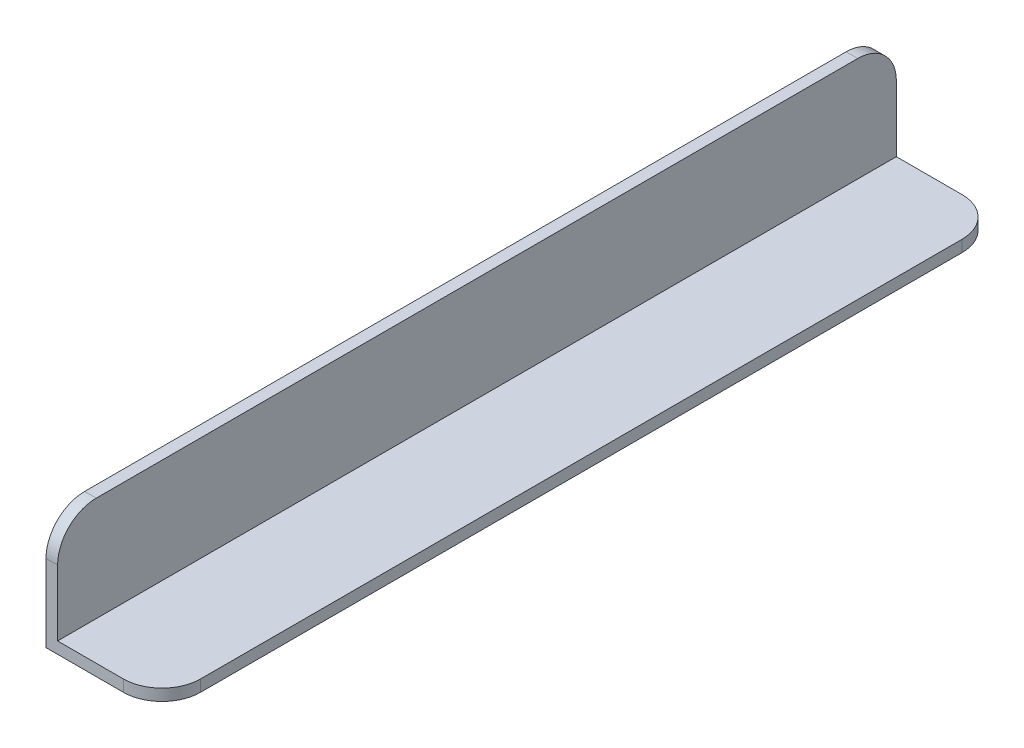
ISO-10303-21;
HEADER;
FILE_DESCRIPTION(('STEP AP214'),'2;1');
FILE_NAME('part.step','',(''),(''),'','','');
FILE_SCHEMA(('AUTOMOTIVE_DESIGN { 1 0 10303 214 1 1 1 1 }'));
ENDSEC;
DATA;
#1=APPLICATION_CONTEXT('core data for automotive mechanical design processes');
#2=APPLICATION_PROTOCOL_DEFINITION('international standard','automotive_design',2000,#1);
#3=PRODUCT_CONTEXT('',#1,'mechanical');
#4=PRODUCT('Part','Part','',(#3));
#5=PRODUCT_RELATED_PRODUCT_CATEGORY('part','',(#4));
#6=PRODUCT_DEFINITION_FORMATION('','',#4);
#7=PRODUCT_DEFINITION_CONTEXT('part definition',#1,'design');
#8=PRODUCT_DEFINITION('design','',#6,#7);
#9=PRODUCT_DEFINITION_SHAPE('','',#8);
#10=(LENGTH_UNIT() NAMED_UNIT(*) SI_UNIT(.MILLI.,.METRE.));
#11=(NAMED_UNIT(*) PLANE_ANGLE_UNIT() SI_UNIT($,.RADIAN.));
#12=(NAMED_UNIT(*) SI_UNIT($,.STERADIAN.) SOLID_ANGLE_UNIT());
#13=UNCERTAINTY_MEASURE_WITH_UNIT(LENGTH_MEASURE(1.E-05),#10,'distance_accuracy_value','');
#14=(GEOMETRIC_REPRESENTATION_CONTEXT(3) GLOBAL_UNCERTAINTY_ASSIGNED_CONTEXT((#13)) GLOBAL_UNIT_ASSIGNED_CONTEXT((#10,
#11,#12)) REPRESENTATION_CONTEXT('',''));
#15=CARTESIAN_POINT('',(0.,0.,0.));
#16=DIRECTION('',(0.,0.,1.));
#17=DIRECTION('',(1.,0.,0.));
#18=AXIS2_PLACEMENT_3D('',#15,#16,#17);
#19=CARTESIAN_POINT('',(0.,60.,217.));
#20=DIRECTION('',(1.,0.,0.));
#21=DIRECTION('',(0.,0.,-1.));
#22=AXIS2_PLACEMENT_3D('',#19,#20,#21);
#23=PLANE('',#22);
#24=DIRECTION('',(0.,0.,-1.));
#25=VECTOR('',#24,1.);
#26=CARTESIAN_POINT('',(0.,60.,217.));
#27=LINE('',#26,#25);
#28=CARTESIAN_POINT('',(0.,60.,197.));
#29=VERTEX_POINT('',#28);
#30=CARTESIAN_POINT('',(0.,60.,-197.));
#31=VERTEX_POINT('',#30);
#32=EDGE_CURVE('E184',#29,#31,#27,.T.);
#33=ORIENTED_EDGE('',*,*,#32,.T.);
#34=CARTESIAN_POINT('',(0.,40.,-197.));
#35=DIRECTION('',(1.,0.,0.));
#36=DIRECTION('',(0.,0.,-1.));
#37=AXIS2_PLACEMENT_3D('',#34,#35,#36);
#38=CIRCLE('',#37,20.);
#39=CARTESIAN_POINT('',(0.,40.,-217.));
#40=VERTEX_POINT('',#39);
#41=EDGE_CURVE('E153',#31,#40,#38,.F.);
#42=ORIENTED_EDGE('',*,*,#41,.T.);
#43=DIRECTION('',(0.,-1.,0.));
#44=VECTOR('',#43,1.);
#45=CARTESIAN_POINT('',(0.,60.,-217.));
#46=LINE('',#45,#44);
#47=CARTESIAN_POINT('',(0.,0.,-217.));
#48=VERTEX_POINT('',#47);
#49=EDGE_CURVE('E137',#40,#48,#46,.T.);
#50=ORIENTED_EDGE('',*,*,#49,.T.);
#51=DIRECTION('',(0.,0.,-1.));
#52=VECTOR('',#51,1.);
#53=CARTESIAN_POINT('',(0.,0.,217.));
#54=LINE('',#53,#52);
#55=CARTESIAN_POINT('',(0.,0.,217.));
#56=VERTEX_POINT('',#55);
#57=EDGE_CURVE('E132',#56,#48,#54,.T.);
#58=ORIENTED_EDGE('',*,*,#57,.F.);
#59=DIRECTION('',(0.,-1.,0.));
#60=VECTOR('',#59,1.);
#61=CARTESIAN_POINT('',(0.,60.,217.));
#62=LINE('',#61,#60);
#63=CARTESIAN_POINT('',(0.,40.,217.));
#64=VERTEX_POINT('',#63);
#65=EDGE_CURVE('E120',#64,#56,#62,.T.);
#66=ORIENTED_EDGE('',*,*,#65,.F.);
#67=CARTESIAN_POINT('',(0.,40.,197.));
#68=DIRECTION('',(1.,0.,0.));
#69=DIRECTION('',(0.,0.,-1.));
#70=AXIS2_PLACEMENT_3D('',#67,#68,#69);
#71=CIRCLE('',#70,20.);
#72=EDGE_CURVE('E151',#64,#29,#71,.F.);
#73=ORIENTED_EDGE('',*,*,#72,.T.);
#74=EDGE_LOOP('',(#33,#42,#50,#58,#66,#73));
#75=FACE_BOUND('',#74,.T.);
#76=ADVANCED_FACE('F41',(#75),#23,.F.);
#77=CARTESIAN_POINT('',(0.,0.,217.));
#78=DIRECTION('',(0.,1.,0.));
#79=DIRECTION('',(0.,0.,1.));
#80=AXIS2_PLACEMENT_3D('',#77,#78,#79);
#81=PLANE('',#80);
#82=DIRECTION('',(1.,0.,0.));
#83=VECTOR('',#82,1.);
#84=CARTESIAN_POINT('',(0.,0.,-217.));
#85=LINE('',#84,#83);
#86=CARTESIAN_POINT('',(40.,0.,-217.));
#87=VERTEX_POINT('',#86);
#88=EDGE_CURVE('E188',#48,#87,#85,.T.);
#89=ORIENTED_EDGE('',*,*,#88,.T.);
#90=CARTESIAN_POINT('',(40.,0.,-197.));
#91=DIRECTION('',(0.,1.,0.));
#92=DIRECTION('',(0.,0.,1.));
#93=AXIS2_PLACEMENT_3D('',#90,#91,#92);
#94=CIRCLE('',#93,20.);
#95=CARTESIAN_POINT('',(60.,0.,-197.));
#96=VERTEX_POINT('',#95);
#97=EDGE_CURVE('E172',#87,#96,#94,.F.);
#98=ORIENTED_EDGE('',*,*,#97,.T.);
#99=DIRECTION('',(0.,0.,-1.));
#100=VECTOR('',#99,1.);
#101=CARTESIAN_POINT('',(60.,0.,217.));
#102=LINE('',#101,#100);
#103=CARTESIAN_POINT('',(60.,0.,197.));
#104=VERTEX_POINT('',#103);
#105=EDGE_CURVE('E140',#104,#96,#102,.T.);
#106=ORIENTED_EDGE('',*,*,#105,.F.);
#107=CARTESIAN_POINT('',(40.,0.,197.));
#108=DIRECTION('',(0.,1.,0.));
#109=DIRECTION('',(0.,0.,1.));
#110=AXIS2_PLACEMENT_3D('',#107,#108,#109);
#111=CIRCLE('',#110,20.);
#112=CARTESIAN_POINT('',(40.,0.,217.));
#113=VERTEX_POINT('',#112);
#114=EDGE_CURVE('E56',#104,#113,#111,.F.);
#115=ORIENTED_EDGE('',*,*,#114,.T.);
#116=DIRECTION('',(1.,0.,0.));
#117=VECTOR('',#116,1.);
#118=CARTESIAN_POINT('',(0.,0.,217.));
#119=LINE('',#118,#117);
#120=EDGE_CURVE('E123',#56,#113,#119,.T.);
#121=ORIENTED_EDGE('',*,*,#120,.F.);
#122=ORIENTED_EDGE('',*,*,#57,.T.);
#123=EDGE_LOOP('',(#89,#98,#106,#115,#121,#122));
#124=FACE_BOUND('',#123,.T.);
#125=ADVANCED_FACE('F131',(#124),#81,.F.);
#126=CARTESIAN_POINT('',(60.,0.,217.));
#127=DIRECTION('',(-1.,0.,0.));
#128=DIRECTION('',(0.,0.,1.));
#129=AXIS2_PLACEMENT_3D('',#126,#127,#128);
#130=PLANE('',#129);
#131=ORIENTED_EDGE('',*,*,#105,.T.);
#132=DIRECTION('',(0.,1.,0.));
#133=VECTOR('',#132,1.);
#134=CARTESIAN_POINT('',(60.,0.,-197.));
#135=LINE('',#134,#133);
#136=CARTESIAN_POINT('',(60.,6.,-197.));
#137=VERTEX_POINT('',#136);
#138=EDGE_CURVE('E165',#96,#137,#135,.T.);
#139=ORIENTED_EDGE('',*,*,#138,.T.);
#140=DIRECTION('',(0.,0.,-1.));
#141=VECTOR('',#140,1.);
#142=CARTESIAN_POINT('',(60.,6.,217.));
#143=LINE('',#142,#141);
#144=CARTESIAN_POINT('',(60.,6.,197.));
#145=VERTEX_POINT('',#144);
#146=EDGE_CURVE('E145',#145,#137,#143,.T.);
#147=ORIENTED_EDGE('',*,*,#146,.F.);
#148=DIRECTION('',(0.,1.,0.));
#149=VECTOR('',#148,1.);
#150=CARTESIAN_POINT('',(60.,0.,197.));
#151=LINE('',#150,#149);
#152=EDGE_CURVE('E163',#145,#104,#151,.F.);
#153=ORIENTED_EDGE('',*,*,#152,.T.);
#154=EDGE_LOOP('',(#131,#139,#147,#153));
#155=FACE_BOUND('',#154,.T.);
#156=ADVANCED_FACE('F200',(#155),#130,.F.);
#157=CARTESIAN_POINT('',(60.,6.,217.));
#158=DIRECTION('',(0.,-1.,0.));
#159=DIRECTION('',(1.,0.,0.));
#160=AXIS2_PLACEMENT_3D('',#157,#158,#159);
#161=PLANE('',#160);
#162=ORIENTED_EDGE('',*,*,#146,.T.);
#163=CARTESIAN_POINT('',(40.,6.,-197.));
#164=DIRECTION('',(0.,-1.,0.));
#165=DIRECTION('',(1.,0.,0.));
#166=AXIS2_PLACEMENT_3D('',#163,#164,#165);
#167=CIRCLE('',#166,20.);
#168=CARTESIAN_POINT('',(40.,6.,-217.));
#169=VERTEX_POINT('',#168);
#170=EDGE_CURVE('E169',#137,#169,#167,.F.);
#171=ORIENTED_EDGE('',*,*,#170,.T.);
#172=DIRECTION('',(-1.,0.,0.));
#173=VECTOR('',#172,1.);
#174=CARTESIAN_POINT('',(60.,6.,-217.));
#175=LINE('',#174,#173);
#176=CARTESIAN_POINT('',(6.,5.99999999999999,-217.));
#177=VERTEX_POINT('',#176);
#178=EDGE_CURVE('E190',#169,#177,#175,.T.);
#179=ORIENTED_EDGE('',*,*,#178,.T.);
#180=DIRECTION('',(0.,0.,-1.));
#181=VECTOR('',#180,1.);
#182=CARTESIAN_POINT('',(6.,5.99999999999999,217.));
#183=LINE('',#182,#181);
#184=CARTESIAN_POINT('',(6.,5.99999999999999,217.));
#185=VERTEX_POINT('',#184);
#186=EDGE_CURVE('E180',#185,#177,#183,.T.);
#187=ORIENTED_EDGE('',*,*,#186,.F.);
#188=DIRECTION('',(-1.,0.,0.));
#189=VECTOR('',#188,1.);
#190=CARTESIAN_POINT('',(60.,6.,217.));
#191=LINE('',#190,#189);
#192=CARTESIAN_POINT('',(40.,6.,217.));
#193=VERTEX_POINT('',#192);
#194=EDGE_CURVE('E133',#193,#185,#191,.T.);
#195=ORIENTED_EDGE('',*,*,#194,.F.);
#196=CARTESIAN_POINT('',(40.,6.,197.));
#197=DIRECTION('',(0.,-1.,0.));
#198=DIRECTION('',(1.,0.,0.));
#199=AXIS2_PLACEMENT_3D('',#196,#197,#198);
#200=CIRCLE('',#199,20.);
#201=EDGE_CURVE('E64',#193,#145,#200,.F.);
#202=ORIENTED_EDGE('',*,*,#201,.T.);
#203=EDGE_LOOP('',(#162,#171,#179,#187,#195,#202));
#204=FACE_BOUND('',#203,.T.);
#205=ADVANCED_FACE('F177',(#204),#161,.F.);
#206=CARTESIAN_POINT('',(6.,5.99999999999999,217.));
#207=DIRECTION('',(-1.,0.,0.));
#208=DIRECTION('',(0.,-1.,0.));
#209=AXIS2_PLACEMENT_3D('',#206,#207,#208);
#210=PLANE('',#209);
#211=DIRECTION('',(0.,1.,0.));
#212=VECTOR('',#211,1.);
#213=CARTESIAN_POINT('',(6.,5.99999999999999,-217.));
#214=LINE('',#213,#212);
#215=CARTESIAN_POINT('',(6.,40.,-217.));
#216=VERTEX_POINT('',#215);
#217=EDGE_CURVE('E127',#177,#216,#214,.T.);
#218=ORIENTED_EDGE('',*,*,#217,.T.);
#219=CARTESIAN_POINT('',(6.,40.,-197.));
#220=DIRECTION('',(-1.,0.,0.));
#221=DIRECTION('',(0.,-1.,0.));
#222=AXIS2_PLACEMENT_3D('',#219,#220,#221);
#223=CIRCLE('',#222,20.);
#224=CARTESIAN_POINT('',(6.,60.,-197.));
#225=VERTEX_POINT('',#224);
#226=EDGE_CURVE('E161',#216,#225,#223,.F.);
#227=ORIENTED_EDGE('',*,*,#226,.T.);
#228=DIRECTION('',(0.,0.,-1.));
#229=VECTOR('',#228,1.);
#230=CARTESIAN_POINT('',(6.,60.,217.));
#231=LINE('',#230,#229);
#232=CARTESIAN_POINT('',(6.,60.,197.));
#233=VERTEX_POINT('',#232);
#234=EDGE_CURVE('E195',#233,#225,#231,.T.);
#235=ORIENTED_EDGE('',*,*,#234,.F.);
#236=CARTESIAN_POINT('',(6.,40.,197.));
#237=DIRECTION('',(-1.,0.,0.));
#238=DIRECTION('',(0.,-1.,0.));
#239=AXIS2_PLACEMENT_3D('',#236,#237,#238);
#240=CIRCLE('',#239,20.);
#241=CARTESIAN_POINT('',(6.,40.,217.));
#242=VERTEX_POINT('',#241);
#243=EDGE_CURVE('E159',#233,#242,#240,.F.);
#244=ORIENTED_EDGE('',*,*,#243,.T.);
#245=DIRECTION('',(0.,1.,0.));
#246=VECTOR('',#245,1.);
#247=CARTESIAN_POINT('',(6.,5.99999999999999,217.));
#248=LINE('',#247,#246);
#249=EDGE_CURVE('E182',#185,#242,#248,.T.);
#250=ORIENTED_EDGE('',*,*,#249,.F.);
#251=ORIENTED_EDGE('',*,*,#186,.T.);
#252=EDGE_LOOP('',(#218,#227,#235,#244,#250,#251));
#253=FACE_BOUND('',#252,.T.);
#254=ADVANCED_FACE('F232',(#253),#210,.F.);
#255=CARTESIAN_POINT('',(6.,60.,217.));
#256=DIRECTION('',(0.,-1.,0.));
#257=DIRECTION('',(0.,0.,-1.));
#258=AXIS2_PLACEMENT_3D('',#255,#256,#257);
#259=PLANE('',#258);
#260=ORIENTED_EDGE('',*,*,#234,.T.);
#261=DIRECTION('',(-1.,0.,0.));
#262=VECTOR('',#261,1.);
#263=CARTESIAN_POINT('',(6.,60.,-197.));
#264=LINE('',#263,#262);
#265=EDGE_CURVE('E142',#225,#31,#264,.T.);
#266=ORIENTED_EDGE('',*,*,#265,.T.);
#267=ORIENTED_EDGE('',*,*,#32,.F.);
#268=DIRECTION('',(-1.,0.,0.));
#269=VECTOR('',#268,1.);
#270=CARTESIAN_POINT('',(6.,60.,197.));
#271=LINE('',#270,#269);
#272=EDGE_CURVE('E139',#29,#233,#271,.F.);
#273=ORIENTED_EDGE('',*,*,#272,.T.);
#274=EDGE_LOOP('',(#260,#266,#267,#273));
#275=FACE_BOUND('',#274,.T.);
#276=ADVANCED_FACE('F239',(#275),#259,.F.);
#277=CARTESIAN_POINT('',(0.,0.,217.));
#278=DIRECTION('',(0.,0.,1.));
#279=DIRECTION('',(1.,0.,0.));
#280=AXIS2_PLACEMENT_3D('',#277,#278,#279);
#281=PLANE('',#280);
#282=ORIENTED_EDGE('',*,*,#249,.T.);
#283=DIRECTION('',(-1.,0.,0.));
#284=VECTOR('',#283,1.);
#285=CARTESIAN_POINT('',(0.,40.,217.));
#286=LINE('',#285,#284);
#287=EDGE_CURVE('E11',#242,#64,#286,.T.);
#288=ORIENTED_EDGE('',*,*,#287,.T.);
#289=ORIENTED_EDGE('',*,*,#65,.T.);
#290=ORIENTED_EDGE('',*,*,#120,.T.);
#291=DIRECTION('',(0.,1.,0.));
#292=VECTOR('',#291,1.);
#293=CARTESIAN_POINT('',(40.,6.,217.));
#294=LINE('',#293,#292);
#295=EDGE_CURVE('E49',#113,#193,#294,.T.);
#296=ORIENTED_EDGE('',*,*,#295,.T.);
#297=ORIENTED_EDGE('',*,*,#194,.T.);
#298=EDGE_LOOP('',(#282,#288,#289,#290,#296,#297));
#299=FACE_BOUND('',#298,.T.);
#300=ADVANCED_FACE('F122',(#299),#281,.T.);
#301=CARTESIAN_POINT('',(0.,0.,-217.));
#302=DIRECTION('',(0.,0.,1.));
#303=DIRECTION('',(1.,0.,0.));
#304=AXIS2_PLACEMENT_3D('',#301,#302,#303);
#305=PLANE('',#304);
#306=ORIENTED_EDGE('',*,*,#49,.F.);
#307=DIRECTION('',(-1.,0.,0.));
#308=VECTOR('',#307,1.);
#309=CARTESIAN_POINT('',(0.,40.,-217.));
#310=LINE('',#309,#308);
#311=EDGE_CURVE('E157',#40,#216,#310,.F.);
#312=ORIENTED_EDGE('',*,*,#311,.T.);
#313=ORIENTED_EDGE('',*,*,#217,.F.);
#314=ORIENTED_EDGE('',*,*,#178,.F.);
#315=DIRECTION('',(0.,1.,0.));
#316=VECTOR('',#315,1.);
#317=CARTESIAN_POINT('',(40.,0.,-217.));
#318=LINE('',#317,#316);
#319=EDGE_CURVE('E155',#169,#87,#318,.F.);
#320=ORIENTED_EDGE('',*,*,#319,.T.);
#321=ORIENTED_EDGE('',*,*,#88,.F.);
#322=EDGE_LOOP('',(#306,#312,#313,#314,#320,#321));
#323=FACE_BOUND('',#322,.T.);
#324=ADVANCED_FACE('F220',(#323),#305,.F.);
#325=CARTESIAN_POINT('',(6.,40.,-197.));
#326=DIRECTION('',(-1.,0.,0.));
#327=DIRECTION('',(0.,0.,1.));
#328=AXIS2_PLACEMENT_3D('',#325,#326,#327);
#329=CYLINDRICAL_SURFACE('',#328,20.);
#330=ORIENTED_EDGE('',*,*,#226,.F.);
#331=ORIENTED_EDGE('',*,*,#311,.F.);
#332=ORIENTED_EDGE('',*,*,#41,.F.);
#333=ORIENTED_EDGE('',*,*,#265,.F.);
#334=EDGE_LOOP('',(#330,#331,#332,#333));
#335=FACE_BOUND('',#334,.T.);
#336=ADVANCED_FACE('F217',(#335),#329,.T.);
#337=CARTESIAN_POINT('',(40.,0.,-197.));
#338=DIRECTION('',(0.,1.,0.));
#339=DIRECTION('',(0.,0.,1.));
#340=AXIS2_PLACEMENT_3D('',#337,#338,#339);
#341=CYLINDRICAL_SURFACE('',#340,20.);
#342=ORIENTED_EDGE('',*,*,#97,.F.);
#343=ORIENTED_EDGE('',*,*,#319,.F.);
#344=ORIENTED_EDGE('',*,*,#170,.F.);
#345=ORIENTED_EDGE('',*,*,#138,.F.);
#346=EDGE_LOOP('',(#342,#343,#344,#345));
#347=FACE_BOUND('',#346,.T.);
#348=ADVANCED_FACE('F207',(#347),#341,.T.);
#349=CARTESIAN_POINT('',(0.,40.,197.));
#350=DIRECTION('',(1.,0.,0.));
#351=DIRECTION('',(0.,0.,-1.));
#352=AXIS2_PLACEMENT_3D('',#349,#350,#351);
#353=CYLINDRICAL_SURFACE('',#352,20.);
#354=ORIENTED_EDGE('',*,*,#243,.F.);
#355=ORIENTED_EDGE('',*,*,#272,.F.);
#356=ORIENTED_EDGE('',*,*,#72,.F.);
#357=ORIENTED_EDGE('',*,*,#287,.F.);
#358=EDGE_LOOP('',(#354,#355,#356,#357));
#359=FACE_BOUND('',#358,.T.);
#360=ADVANCED_FACE('F203',(#359),#353,.T.);
#361=CARTESIAN_POINT('',(40.,0.,197.));
#362=DIRECTION('',(0.,-1.,0.));
#363=DIRECTION('',(0.,0.,-1.));
#364=AXIS2_PLACEMENT_3D('',#361,#362,#363);
#365=CYLINDRICAL_SURFACE('',#364,20.);
#366=ORIENTED_EDGE('',*,*,#114,.F.);
#367=ORIENTED_EDGE('',*,*,#152,.F.);
#368=ORIENTED_EDGE('',*,*,#201,.F.);
#369=ORIENTED_EDGE('',*,*,#295,.F.);
#370=EDGE_LOOP('',(#366,#367,#368,#369));
#371=FACE_BOUND('',#370,.T.);
#372=ADVANCED_FACE('F43',(#371),#365,.T.);
#373=CLOSED_SHELL('',(#76,#125,#156,#205,#254,#276,#300,#324,#336,#348,#360,#372));
#374=MANIFOLD_SOLID_BREP('B2',#373);
#375=ADVANCED_BREP_SHAPE_REPRESENTATION('',(#18,#374),#14);
#376=SHAPE_DEFINITION_REPRESENTATION(#9,#375);
ENDSEC;
END-ISO-10303-21;
